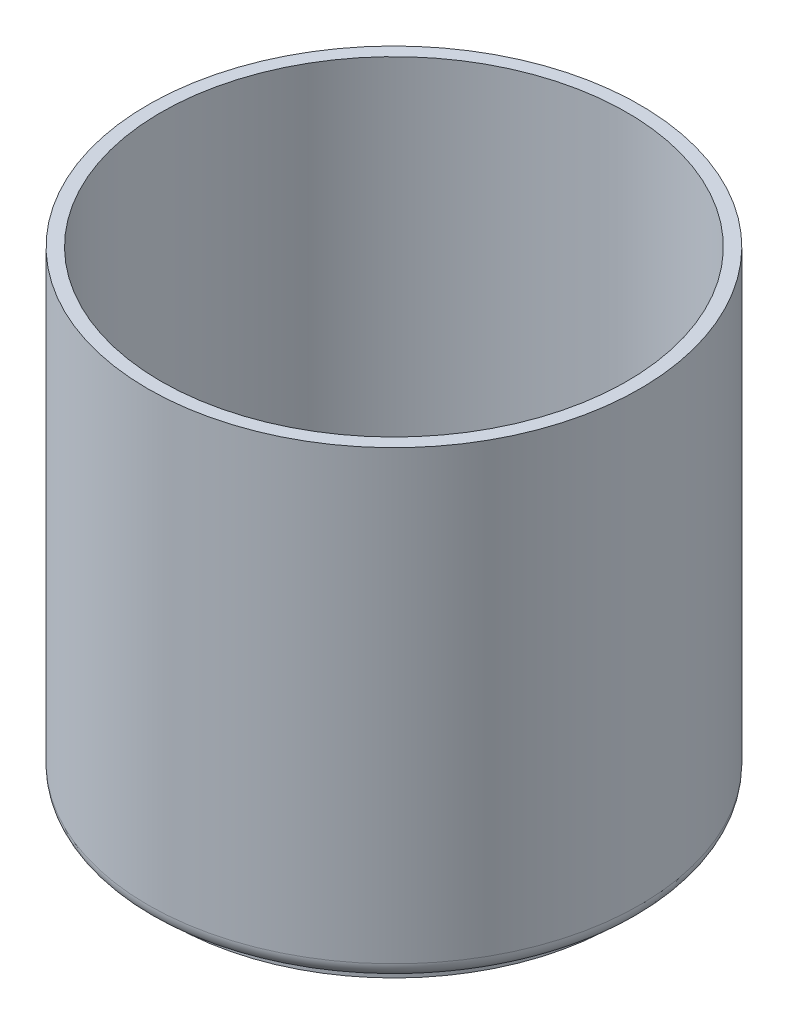
ISO-10303-21;
HEADER;
FILE_DESCRIPTION(('STEP AP214'),'2;1');
FILE_NAME('part.step','',(''),(''),'','','');
FILE_SCHEMA(('AUTOMOTIVE_DESIGN { 1 0 10303 214 1 1 1 1 }'));
ENDSEC;
DATA;
#1=APPLICATION_CONTEXT('core data for automotive mechanical design processes');
#2=APPLICATION_PROTOCOL_DEFINITION('international standard','automotive_design',2000,#1);
#3=PRODUCT_CONTEXT('',#1,'mechanical');
#4=PRODUCT('Part','Part','',(#3));
#5=PRODUCT_RELATED_PRODUCT_CATEGORY('part','',(#4));
#6=PRODUCT_DEFINITION_FORMATION('','',#4);
#7=PRODUCT_DEFINITION_CONTEXT('part definition',#1,'design');
#8=PRODUCT_DEFINITION('design','',#6,#7);
#9=PRODUCT_DEFINITION_SHAPE('','',#8);
#10=(LENGTH_UNIT() NAMED_UNIT(*) SI_UNIT(.MILLI.,.METRE.));
#11=(NAMED_UNIT(*) PLANE_ANGLE_UNIT() SI_UNIT($,.RADIAN.));
#12=(NAMED_UNIT(*) SI_UNIT($,.STERADIAN.) SOLID_ANGLE_UNIT());
#13=UNCERTAINTY_MEASURE_WITH_UNIT(LENGTH_MEASURE(1.E-05),#10,'distance_accuracy_value','');
#14=(GEOMETRIC_REPRESENTATION_CONTEXT(3) GLOBAL_UNCERTAINTY_ASSIGNED_CONTEXT((#13)) GLOBAL_UNIT_ASSIGNED_CONTEXT((#10,
#11,#12)) REPRESENTATION_CONTEXT('',''));
#15=CARTESIAN_POINT('',(0.,0.,0.));
#16=DIRECTION('',(0.,0.,1.));
#17=DIRECTION('',(1.,0.,0.));
#18=AXIS2_PLACEMENT_3D('',#15,#16,#17);
#19=CARTESIAN_POINT('',(0.,0.,0.));
#20=DIRECTION('',(0.,1.,0.));
#21=DIRECTION('',(0.,0.,1.));
#22=AXIS2_PLACEMENT_3D('',#19,#20,#21);
#23=PLANE('',#22);
#24=CARTESIAN_POINT('',(0.,0.,0.));
#25=DIRECTION('',(0.,1.,0.));
#26=DIRECTION('',(0.,0.,1.));
#27=AXIS2_PLACEMENT_3D('',#24,#25,#26);
#28=CIRCLE('',#27,86.36);
#29=CARTESIAN_POINT('',(0.,0.,86.36));
#30=VERTEX_POINT('',#29);
#31=EDGE_CURVE('E54',#30,#30,#28,.T.);
#32=ORIENTED_EDGE('',*,*,#31,.F.);
#33=EDGE_LOOP('',(#32));
#34=FACE_BOUND('',#33,.T.);
#35=CARTESIAN_POINT('',(0.,0.,0.));
#36=DIRECTION('',(0.,1.,0.));
#37=DIRECTION('',(0.,0.,1.));
#38=AXIS2_PLACEMENT_3D('',#35,#36,#37);
#39=CIRCLE('',#38,80.518);
#40=CARTESIAN_POINT('',(0.,0.,80.518));
#41=VERTEX_POINT('',#40);
#42=EDGE_CURVE('E57',#41,#41,#39,.T.);
#43=ORIENTED_EDGE('',*,*,#42,.T.);
#44=EDGE_LOOP('',(#43));
#45=FACE_BOUND('',#44,.T.);
#46=ADVANCED_FACE('F33',(#34,#45),#23,.F.);
#47=CARTESIAN_POINT('',(0.,5.08,0.));
#48=DIRECTION('',(0.,-1.,0.));
#49=DIRECTION('',(0.,0.,-1.));
#50=AXIS2_PLACEMENT_3D('',#47,#48,#49);
#51=CYLINDRICAL_SURFACE('',#50,86.36);
#52=CARTESIAN_POINT('',(0.,5.08,0.));
#53=DIRECTION('',(0.,1.,0.));
#54=DIRECTION('',(0.,0.,1.));
#55=AXIS2_PLACEMENT_3D('',#52,#53,#54);
#56=CIRCLE('',#55,86.36);
#57=CARTESIAN_POINT('',(0.,5.08,86.36));
#58=VERTEX_POINT('',#57);
#59=EDGE_CURVE('E53',#58,#58,#56,.T.);
#60=ORIENTED_EDGE('',*,*,#59,.F.);
#61=EDGE_LOOP('',(#60));
#62=FACE_BOUND('',#61,.T.);
#63=ORIENTED_EDGE('',*,*,#31,.T.);
#64=EDGE_LOOP('',(#63));
#65=FACE_BOUND('',#64,.T.);
#66=ADVANCED_FACE('F91',(#62,#65),#51,.T.);
#67=CARTESIAN_POINT('',(0.,5.08,0.));
#68=DIRECTION('',(0.,-1.,0.));
#69=DIRECTION('',(0.,0.,-1.));
#70=AXIS2_PLACEMENT_3D('',#67,#68,#69);
#71=CYLINDRICAL_SURFACE('',#70,80.518);
#72=CARTESIAN_POINT('',(0.,5.08,0.));
#73=DIRECTION('',(0.,1.,0.));
#74=DIRECTION('',(0.,0.,1.));
#75=AXIS2_PLACEMENT_3D('',#72,#73,#74);
#76=CIRCLE('',#75,80.518);
#77=CARTESIAN_POINT('',(0.,5.08,80.518));
#78=VERTEX_POINT('',#77);
#79=EDGE_CURVE('E62',#78,#78,#76,.T.);
#80=ORIENTED_EDGE('',*,*,#79,.T.);
#81=EDGE_LOOP('',(#80));
#82=FACE_BOUND('',#81,.T.);
#83=ORIENTED_EDGE('',*,*,#42,.F.);
#84=EDGE_LOOP('',(#83));
#85=FACE_BOUND('',#84,.T.);
#86=ADVANCED_FACE('F97',(#82,#85),#71,.F.);
#87=CARTESIAN_POINT('',(0.,5.08,0.));
#88=DIRECTION('',(0.,1.,0.));
#89=DIRECTION('',(0.,0.,1.));
#90=AXIS2_PLACEMENT_3D('',#87,#88,#89);
#91=PLANE('',#90);
#92=ORIENTED_EDGE('',*,*,#79,.F.);
#93=EDGE_LOOP('',(#92));
#94=FACE_BOUND('',#93,.T.);
#95=ADVANCED_FACE('F88',(#94),#91,.F.);
#96=CARTESIAN_POINT('',(0.,10.16,0.));
#97=DIRECTION('',(0.,-1.,0.));
#98=DIRECTION('',(0.,0.,-1.));
#99=AXIS2_PLACEMENT_3D('',#96,#97,#98);
#100=CYLINDRICAL_SURFACE('',#99,95.758);
#101=CARTESIAN_POINT('',(0.,11.43,0.));
#102=DIRECTION('',(0.,1.,0.));
#103=DIRECTION('',(0.,0.,1.));
#104=AXIS2_PLACEMENT_3D('',#101,#102,#103);
#105=CIRCLE('',#104,95.758);
#106=CARTESIAN_POINT('',(0.,11.43,95.758));
#107=VERTEX_POINT('',#106);
#108=EDGE_CURVE('E40',#107,#107,#105,.T.);
#109=ORIENTED_EDGE('',*,*,#108,.T.);
#110=EDGE_LOOP('',(#109));
#111=FACE_BOUND('',#110,.T.);
#112=CARTESIAN_POINT('',(0.,185.42,0.));
#113=DIRECTION('',(0.,1.,0.));
#114=DIRECTION('',(0.,0.,1.));
#115=AXIS2_PLACEMENT_3D('',#112,#113,#114);
#116=CIRCLE('',#115,95.758);
#117=CARTESIAN_POINT('',(0.,185.42,95.758));
#118=VERTEX_POINT('',#117);
#119=EDGE_CURVE('E65',#118,#118,#116,.T.);
#120=ORIENTED_EDGE('',*,*,#119,.F.);
#121=EDGE_LOOP('',(#120));
#122=FACE_BOUND('',#121,.T.);
#123=ADVANCED_FACE('F86',(#111,#122),#100,.T.);
#124=CARTESIAN_POINT('',(0.,5.08,0.));
#125=DIRECTION('',(0.,1.,0.));
#126=DIRECTION('',(0.,0.,1.));
#127=AXIS2_PLACEMENT_3D('',#124,#125,#126);
#128=CIRCLE('',#127,89.408);
#129=CARTESIAN_POINT('',(0.,5.08,89.408));
#130=VERTEX_POINT('',#129);
#131=EDGE_CURVE('E10',#130,#130,#128,.F.);
#132=ORIENTED_EDGE('',*,*,#131,.T.);
#133=EDGE_LOOP('',(#132));
#134=FACE_BOUND('',#133,.T.);
#135=ORIENTED_EDGE('',*,*,#59,.T.);
#136=EDGE_LOOP('',(#135));
#137=FACE_BOUND('',#136,.T.);
#138=ADVANCED_FACE('F76',(#134,#137),#91,.F.);
#139=CARTESIAN_POINT('',(0.,185.42,0.));
#140=DIRECTION('',(0.,1.,0.));
#141=DIRECTION('',(0.,0.,1.));
#142=AXIS2_PLACEMENT_3D('',#139,#140,#141);
#143=PLANE('',#142);
#144=ORIENTED_EDGE('',*,*,#119,.T.);
#145=EDGE_LOOP('',(#144));
#146=FACE_BOUND('',#145,.T.);
#147=CARTESIAN_POINT('',(0.,185.42,0.));
#148=DIRECTION('',(0.,1.,0.));
#149=DIRECTION('',(0.,0.,1.));
#150=AXIS2_PLACEMENT_3D('',#147,#148,#149);
#151=CIRCLE('',#150,90.678);
#152=CARTESIAN_POINT('',(0.,185.42,90.678));
#153=VERTEX_POINT('',#152);
#154=EDGE_CURVE('E68',#153,#153,#151,.T.);
#155=ORIENTED_EDGE('',*,*,#154,.F.);
#156=EDGE_LOOP('',(#155));
#157=FACE_BOUND('',#156,.T.);
#158=ADVANCED_FACE('F74',(#146,#157),#143,.T.);
#159=CARTESIAN_POINT('',(0.,185.42,0.));
#160=DIRECTION('',(0.,-1.,0.));
#161=DIRECTION('',(0.,0.,-1.));
#162=AXIS2_PLACEMENT_3D('',#159,#160,#161);
#163=CYLINDRICAL_SURFACE('',#162,90.678);
#164=CARTESIAN_POINT('',(0.,16.51,0.));
#165=DIRECTION('',(0.,1.,0.));
#166=DIRECTION('',(0.,0.,1.));
#167=AXIS2_PLACEMENT_3D('',#164,#165,#166);
#168=CIRCLE('',#167,90.678);
#169=CARTESIAN_POINT('',(0.,16.51,90.678));
#170=VERTEX_POINT('',#169);
#171=EDGE_CURVE('E48',#170,#170,#168,.F.);
#172=ORIENTED_EDGE('',*,*,#171,.T.);
#173=EDGE_LOOP('',(#172));
#174=FACE_BOUND('',#173,.T.);
#175=ORIENTED_EDGE('',*,*,#154,.T.);
#176=EDGE_LOOP('',(#175));
#177=FACE_BOUND('',#176,.T.);
#178=ADVANCED_FACE('F72',(#174,#177),#163,.F.);
#179=CARTESIAN_POINT('',(0.,10.16,0.));
#180=DIRECTION('',(0.,1.,0.));
#181=DIRECTION('',(0.,0.,1.));
#182=AXIS2_PLACEMENT_3D('',#179,#180,#181);
#183=PLANE('',#182);
#184=CARTESIAN_POINT('',(0.,10.16,0.));
#185=DIRECTION('',(0.,1.,0.));
#186=DIRECTION('',(0.,0.,1.));
#187=AXIS2_PLACEMENT_3D('',#184,#185,#186);
#188=CIRCLE('',#187,84.328);
#189=CARTESIAN_POINT('',(0.,10.16,84.328));
#190=VERTEX_POINT('',#189);
#191=EDGE_CURVE('E44',#190,#190,#188,.T.);
#192=ORIENTED_EDGE('',*,*,#191,.T.);
#193=EDGE_LOOP('',(#192));
#194=FACE_BOUND('',#193,.T.);
#195=ADVANCED_FACE('F83',(#194),#183,.T.);
#196=CARTESIAN_POINT('',(0.,16.51,0.));
#197=DIRECTION('',(0.,1.,0.));
#198=DIRECTION('',(0.,0.,1.));
#199=AXIS2_PLACEMENT_3D('',#196,#197,#198);
#200=TOROIDAL_SURFACE('',#199,84.328,6.35);
#201=ORIENTED_EDGE('',*,*,#191,.F.);
#202=EDGE_LOOP('',(#201));
#203=FACE_BOUND('',#202,.T.);
#204=ORIENTED_EDGE('',*,*,#171,.F.);
#205=EDGE_LOOP('',(#204));
#206=FACE_BOUND('',#205,.T.);
#207=ADVANCED_FACE('F104',(#203,#206),#200,.F.);
#208=CARTESIAN_POINT('',(0.,11.43,0.));
#209=DIRECTION('',(0.,1.,0.));
#210=DIRECTION('',(0.,0.,1.));
#211=AXIS2_PLACEMENT_3D('',#208,#209,#210);
#212=TOROIDAL_SURFACE('',#211,89.408,6.35);
#213=ORIENTED_EDGE('',*,*,#131,.F.);
#214=EDGE_LOOP('',(#213));
#215=FACE_BOUND('',#214,.T.);
#216=ORIENTED_EDGE('',*,*,#108,.F.);
#217=EDGE_LOOP('',(#216));
#218=FACE_BOUND('',#217,.T.);
#219=ADVANCED_FACE('F35',(#215,#218),#212,.T.);
#220=CLOSED_SHELL('',(#46,#66,#86,#95,#123,#138,#158,#178,#195,#207,#219));
#221=MANIFOLD_SOLID_BREP('B2',#220);
#222=ADVANCED_BREP_SHAPE_REPRESENTATION('',(#18,#221),#14);
#223=SHAPE_DEFINITION_REPRESENTATION(#9,#222);
ENDSEC;
END-ISO-10303-21;
